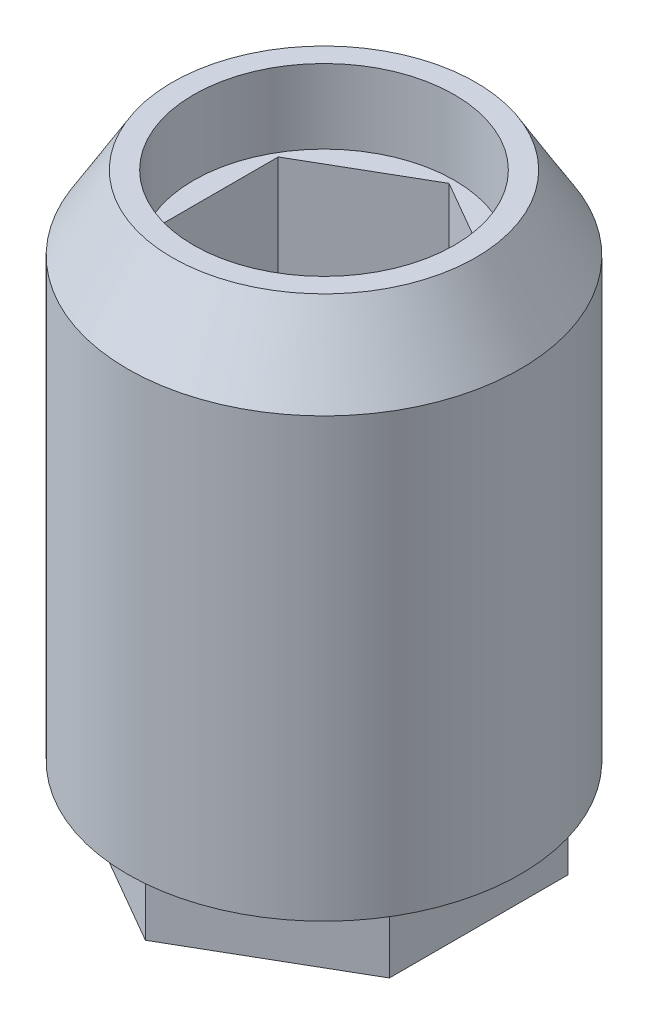
ISO-10303-21;
HEADER;
FILE_DESCRIPTION(('STEP AP214'),'2;1');
FILE_NAME('part.step','',(''),(''),'','','');
FILE_SCHEMA(('AUTOMOTIVE_DESIGN { 1 0 10303 214 1 1 1 1 }'));
ENDSEC;
DATA;
#1=APPLICATION_CONTEXT('core data for automotive mechanical design processes');
#2=APPLICATION_PROTOCOL_DEFINITION('international standard','automotive_design',2000,#1);
#3=PRODUCT_CONTEXT('',#1,'mechanical');
#4=PRODUCT('Part','Part','',(#3));
#5=PRODUCT_RELATED_PRODUCT_CATEGORY('part','',(#4));
#6=PRODUCT_DEFINITION_FORMATION('','',#4);
#7=PRODUCT_DEFINITION_CONTEXT('part definition',#1,'design');
#8=PRODUCT_DEFINITION('design','',#6,#7);
#9=PRODUCT_DEFINITION_SHAPE('','',#8);
#10=(LENGTH_UNIT() NAMED_UNIT(*) SI_UNIT(.MILLI.,.METRE.));
#11=(NAMED_UNIT(*) PLANE_ANGLE_UNIT() SI_UNIT($,.RADIAN.));
#12=(NAMED_UNIT(*) SI_UNIT($,.STERADIAN.) SOLID_ANGLE_UNIT());
#13=UNCERTAINTY_MEASURE_WITH_UNIT(LENGTH_MEASURE(1.E-05),#10,'distance_accuracy_value','');
#14=(GEOMETRIC_REPRESENTATION_CONTEXT(3) GLOBAL_UNCERTAINTY_ASSIGNED_CONTEXT((#13)) GLOBAL_UNIT_ASSIGNED_CONTEXT((#10,
#11,#12)) REPRESENTATION_CONTEXT('',''));
#15=CARTESIAN_POINT('',(0.,0.,0.));
#16=DIRECTION('',(0.,0.,1.));
#17=DIRECTION('',(1.,0.,0.));
#18=AXIS2_PLACEMENT_3D('',#15,#16,#17);
#19=CARTESIAN_POINT('',(0.,0.000100000000002876,7.));
#20=DIRECTION('',(-0.5,0.,0.866025403784439));
#21=DIRECTION('',(0.866025403784439,0.,0.5));
#22=AXIS2_PLACEMENT_3D('',#19,#20,#21);
#23=PLANE('',#22);
#24=DIRECTION('',(-0.866025403784439,0.,-0.5));
#25=VECTOR('',#24,1.);
#26=CARTESIAN_POINT('',(0.,-4.15,7.));
#27=LINE('',#26,#25);
#28=CARTESIAN_POINT('',(0.,-4.15,7.));
#29=VERTEX_POINT('',#28);
#30=CARTESIAN_POINT('',(-6.06217782649107,-4.15,3.5));
#31=VERTEX_POINT('',#30);
#32=EDGE_CURVE('E76',#29,#31,#27,.T.);
#33=ORIENTED_EDGE('',*,*,#32,.F.);
#34=DIRECTION('',(0.,-1.,0.));
#35=VECTOR('',#34,1.);
#36=CARTESIAN_POINT('',(0.,0.000100000000002876,7.));
#37=LINE('',#36,#35);
#38=CARTESIAN_POINT('',(0.,-12.,7.));
#39=VERTEX_POINT('',#38);
#40=EDGE_CURVE('E63',#29,#39,#37,.T.);
#41=ORIENTED_EDGE('',*,*,#40,.T.);
#42=DIRECTION('',(-0.866025403784439,0.,-0.5));
#43=VECTOR('',#42,1.);
#44=CARTESIAN_POINT('',(0.,-12.,7.));
#45=LINE('',#44,#43);
#46=CARTESIAN_POINT('',(-6.06217749556715,-12.,3.49999980890768));
#47=VERTEX_POINT('',#46);
#48=EDGE_CURVE('E357',#39,#47,#45,.T.);
#49=ORIENTED_EDGE('',*,*,#48,.T.);
#50=DIRECTION('',(0.,-1.,0.));
#51=VECTOR('',#50,1.);
#52=CARTESIAN_POINT('',(-6.06217782649107,0.000100000000002876,3.5));
#53=LINE('',#52,#51);
#54=EDGE_CURVE('E204',#31,#47,#53,.T.);
#55=ORIENTED_EDGE('',*,*,#54,.F.);
#56=EDGE_LOOP('',(#33,#41,#49,#55));
#57=FACE_BOUND('',#56,.T.);
#58=ADVANCED_FACE('F58',(#57),#23,.F.);
#59=CARTESIAN_POINT('',(6.06217782649107,0.000100000000002876,3.5));
#60=DIRECTION('',(0.5,0.,0.866025403784439));
#61=DIRECTION('',(0.866025403784439,0.,-0.5));
#62=AXIS2_PLACEMENT_3D('',#59,#60,#61);
#63=PLANE('',#62);
#64=DIRECTION('',(-0.866025403784439,0.,0.5));
#65=VECTOR('',#64,1.);
#66=CARTESIAN_POINT('',(6.06217782649107,-4.15,3.5));
#67=LINE('',#66,#65);
#68=CARTESIAN_POINT('',(6.06217782649107,-4.15,3.5));
#69=VERTEX_POINT('',#68);
#70=EDGE_CURVE('E484',#69,#29,#67,.T.);
#71=ORIENTED_EDGE('',*,*,#70,.F.);
#72=DIRECTION('',(0.,-1.,0.));
#73=VECTOR('',#72,1.);
#74=CARTESIAN_POINT('',(6.06217782649107,0.000100000000002876,3.5));
#75=LINE('',#74,#73);
#76=CARTESIAN_POINT('',(6.06217881883642,-12.,3.50000057292716));
#77=VERTEX_POINT('',#76);
#78=EDGE_CURVE('E239',#69,#77,#75,.T.);
#79=ORIENTED_EDGE('',*,*,#78,.T.);
#80=DIRECTION('',(-0.866025403784439,0.,0.5));
#81=VECTOR('',#80,1.);
#82=CARTESIAN_POINT('',(6.06217782649107,-12.,3.5));
#83=LINE('',#82,#81);
#84=EDGE_CURVE('E391',#77,#39,#83,.T.);
#85=ORIENTED_EDGE('',*,*,#84,.T.);
#86=ORIENTED_EDGE('',*,*,#40,.F.);
#87=EDGE_LOOP('',(#71,#79,#85,#86));
#88=FACE_BOUND('',#87,.T.);
#89=ADVANCED_FACE('F741',(#88),#63,.F.);
#90=CARTESIAN_POINT('',(6.06217782649107,0.000100000000002876,-3.5));
#91=DIRECTION('',(1.,0.,0.));
#92=DIRECTION('',(0.,0.,-1.));
#93=AXIS2_PLACEMENT_3D('',#90,#91,#92);
#94=PLANE('',#93);
#95=DIRECTION('',(0.,0.,1.));
#96=VECTOR('',#95,1.);
#97=CARTESIAN_POINT('',(6.06217782649107,-4.15,-3.5));
#98=LINE('',#97,#96);
#99=CARTESIAN_POINT('',(6.06217782649107,-4.15,-3.5));
#100=VERTEX_POINT('',#99);
#101=EDGE_CURVE('E485',#100,#69,#98,.T.);
#102=ORIENTED_EDGE('',*,*,#101,.F.);
#103=DIRECTION('',(0.,-1.,0.));
#104=VECTOR('',#103,1.);
#105=CARTESIAN_POINT('',(6.06217782649107,0.000100000000002876,-3.5));
#106=LINE('',#105,#104);
#107=CARTESIAN_POINT('',(6.06217749556715,-12.,-3.49999980890768));
#108=VERTEX_POINT('',#107);
#109=EDGE_CURVE('E231',#100,#108,#106,.T.);
#110=ORIENTED_EDGE('',*,*,#109,.T.);
#111=DIRECTION('',(0.,0.,1.));
#112=VECTOR('',#111,1.);
#113=CARTESIAN_POINT('',(6.06217782649107,-12.,-3.5));
#114=LINE('',#113,#112);
#115=EDGE_CURVE('E395',#108,#77,#114,.T.);
#116=ORIENTED_EDGE('',*,*,#115,.T.);
#117=ORIENTED_EDGE('',*,*,#78,.F.);
#118=EDGE_LOOP('',(#102,#110,#116,#117));
#119=FACE_BOUND('',#118,.T.);
#120=ADVANCED_FACE('F746',(#119),#94,.F.);
#121=CARTESIAN_POINT('',(0.,0.000100000000002876,-7.));
#122=DIRECTION('',(0.5,0.,-0.866025403784438));
#123=DIRECTION('',(-0.866025403784438,0.,-0.5));
#124=AXIS2_PLACEMENT_3D('',#121,#122,#123);
#125=PLANE('',#124);
#126=DIRECTION('',(0.866025403784438,0.,0.5));
#127=VECTOR('',#126,1.);
#128=CARTESIAN_POINT('',(0.,-4.15,-7.));
#129=LINE('',#128,#127);
#130=CARTESIAN_POINT('',(0.,-4.15,-7.));
#131=VERTEX_POINT('',#130);
#132=EDGE_CURVE('E193',#131,#100,#129,.T.);
#133=ORIENTED_EDGE('',*,*,#132,.F.);
#134=DIRECTION('',(0.,-1.,0.));
#135=VECTOR('',#134,1.);
#136=CARTESIAN_POINT('',(0.,0.000100000000002876,-7.));
#137=LINE('',#136,#135);
#138=CARTESIAN_POINT('',(0.,-12.,-7.));
#139=VERTEX_POINT('',#138);
#140=EDGE_CURVE('E192',#131,#139,#137,.T.);
#141=ORIENTED_EDGE('',*,*,#140,.T.);
#142=DIRECTION('',(0.866025403784438,0.,0.5));
#143=VECTOR('',#142,1.);
#144=CARTESIAN_POINT('',(0.,-12.,-7.));
#145=LINE('',#144,#143);
#146=EDGE_CURVE('E400',#139,#108,#145,.T.);
#147=ORIENTED_EDGE('',*,*,#146,.T.);
#148=ORIENTED_EDGE('',*,*,#109,.F.);
#149=EDGE_LOOP('',(#133,#141,#147,#148));
#150=FACE_BOUND('',#149,.T.);
#151=ADVANCED_FACE('F780',(#150),#125,.F.);
#152=CARTESIAN_POINT('',(-6.06217782649107,0.000100000000002876,-3.5));
#153=DIRECTION('',(-0.5,0.,-0.866025403784439));
#154=DIRECTION('',(-0.866025403784438,0.,0.5));
#155=AXIS2_PLACEMENT_3D('',#152,#153,#154);
#156=PLANE('',#155);
#157=DIRECTION('',(0.866025403784438,0.,-0.5));
#158=VECTOR('',#157,1.);
#159=CARTESIAN_POINT('',(-6.06217782649107,-4.15,-3.5));
#160=LINE('',#159,#158);
#161=CARTESIAN_POINT('',(-6.06217782649107,-4.15,-3.5));
#162=VERTEX_POINT('',#161);
#163=EDGE_CURVE('E186',#162,#131,#160,.T.);
#164=ORIENTED_EDGE('',*,*,#163,.F.);
#165=DIRECTION('',(0.,-1.,0.));
#166=VECTOR('',#165,1.);
#167=CARTESIAN_POINT('',(-6.06217782649107,0.000100000000002876,-3.5));
#168=LINE('',#167,#166);
#169=CARTESIAN_POINT('',(-6.06217782649107,-12.,-3.5));
#170=VERTEX_POINT('',#169);
#171=EDGE_CURVE('E84',#162,#170,#168,.T.);
#172=ORIENTED_EDGE('',*,*,#171,.T.);
#173=DIRECTION('',(0.866025403784438,0.,-0.5));
#174=VECTOR('',#173,1.);
#175=CARTESIAN_POINT('',(-6.06217782649107,-12.,-3.5));
#176=LINE('',#175,#174);
#177=EDGE_CURVE('E333',#170,#139,#176,.T.);
#178=ORIENTED_EDGE('',*,*,#177,.T.);
#179=ORIENTED_EDGE('',*,*,#140,.F.);
#180=EDGE_LOOP('',(#164,#172,#178,#179));
#181=FACE_BOUND('',#180,.T.);
#182=ADVANCED_FACE('F191',(#181),#156,.F.);
#183=CARTESIAN_POINT('',(-6.06217782649107,0.000100000000002876,3.5));
#184=DIRECTION('',(-1.,0.,0.));
#185=DIRECTION('',(0.,0.,1.));
#186=AXIS2_PLACEMENT_3D('',#183,#184,#185);
#187=PLANE('',#186);
#188=DIRECTION('',(0.,0.,-1.));
#189=VECTOR('',#188,1.);
#190=CARTESIAN_POINT('',(-6.06217782649107,-4.15,3.5));
#191=LINE('',#190,#189);
#192=EDGE_CURVE('E12',#31,#162,#191,.T.);
#193=ORIENTED_EDGE('',*,*,#192,.F.);
#194=ORIENTED_EDGE('',*,*,#54,.T.);
#195=DIRECTION('',(0.,0.,-1.));
#196=VECTOR('',#195,1.);
#197=CARTESIAN_POINT('',(-6.06217782649107,-12.,3.5));
#198=LINE('',#197,#196);
#199=EDGE_CURVE('E199',#47,#170,#198,.T.);
#200=ORIENTED_EDGE('',*,*,#199,.T.);
#201=ORIENTED_EDGE('',*,*,#171,.F.);
#202=EDGE_LOOP('',(#193,#194,#200,#201));
#203=FACE_BOUND('',#202,.T.);
#204=ADVANCED_FACE('F197',(#203),#187,.F.);
#205=DIRECTION('',(-0.866025403784439,0.,-0.5));
#206=VECTOR('',#205,1.);
#207=CARTESIAN_POINT('',(0.,-20.35,7.));
#208=LINE('',#207,#206);
#209=CARTESIAN_POINT('',(0.,-20.35,7.));
#210=VERTEX_POINT('',#209);
#211=CARTESIAN_POINT('',(-6.06217782649107,-20.35,3.5));
#212=VERTEX_POINT('',#211);
#213=EDGE_CURVE('E370',#210,#212,#208,.T.);
#214=ORIENTED_EDGE('',*,*,#213,.F.);
#215=CARTESIAN_POINT('',(0.,-32.35,7.));
#216=VERTEX_POINT('',#215);
#217=EDGE_CURVE('E240',#210,#216,#37,.T.);
#218=ORIENTED_EDGE('',*,*,#217,.T.);
#219=DIRECTION('',(-0.866025403784438,0.,-0.5));
#220=VECTOR('',#219,1.);
#221=CARTESIAN_POINT('',(0.,-32.35,7.));
#222=LINE('',#221,#220);
#223=CARTESIAN_POINT('',(-6.06217782649107,-32.35,3.5));
#224=VERTEX_POINT('',#223);
#225=EDGE_CURVE('E272',#216,#224,#222,.T.);
#226=ORIENTED_EDGE('',*,*,#225,.T.);
#227=EDGE_CURVE('E220',#212,#224,#53,.T.);
#228=ORIENTED_EDGE('',*,*,#227,.F.);
#229=EDGE_LOOP('',(#214,#218,#226,#228));
#230=FACE_BOUND('',#229,.T.);
#231=ADVANCED_FACE('F742',(#230),#23,.F.);
#232=DIRECTION('',(-0.866025403784439,0.,0.5));
#233=VECTOR('',#232,1.);
#234=CARTESIAN_POINT('',(6.06217782649107,-20.35,3.5));
#235=LINE('',#234,#233);
#236=CARTESIAN_POINT('',(6.06217749556714,-20.35,3.49999980890768));
#237=VERTEX_POINT('',#236);
#238=EDGE_CURVE('E256',#237,#210,#235,.T.);
#239=ORIENTED_EDGE('',*,*,#238,.F.);
#240=CARTESIAN_POINT('',(6.06217782649107,-32.35,3.5));
#241=VERTEX_POINT('',#240);
#242=EDGE_CURVE('E232',#237,#241,#75,.T.);
#243=ORIENTED_EDGE('',*,*,#242,.T.);
#244=DIRECTION('',(-0.866025403784439,0.,0.5));
#245=VECTOR('',#244,1.);
#246=CARTESIAN_POINT('',(6.06217782649107,-32.35,3.5));
#247=LINE('',#246,#245);
#248=EDGE_CURVE('E254',#241,#216,#247,.T.);
#249=ORIENTED_EDGE('',*,*,#248,.T.);
#250=ORIENTED_EDGE('',*,*,#217,.F.);
#251=EDGE_LOOP('',(#239,#243,#249,#250));
#252=FACE_BOUND('',#251,.T.);
#253=ADVANCED_FACE('F251',(#252),#63,.F.);
#254=DIRECTION('',(0.,0.,1.));
#255=VECTOR('',#254,1.);
#256=CARTESIAN_POINT('',(6.06217782649107,-20.35,-3.5));
#257=LINE('',#256,#255);
#258=CARTESIAN_POINT('',(6.0621788188364,-20.35,-3.50000057292714));
#259=VERTEX_POINT('',#258);
#260=EDGE_CURVE('E378',#259,#237,#257,.T.);
#261=ORIENTED_EDGE('',*,*,#260,.F.);
#262=CARTESIAN_POINT('',(6.06217782649107,-32.35,-3.5));
#263=VERTEX_POINT('',#262);
#264=EDGE_CURVE('E229',#259,#263,#106,.T.);
#265=ORIENTED_EDGE('',*,*,#264,.T.);
#266=DIRECTION('',(0.,0.,1.));
#267=VECTOR('',#266,1.);
#268=CARTESIAN_POINT('',(6.06217782649107,-32.35,-3.5));
#269=LINE('',#268,#267);
#270=EDGE_CURVE('E260',#263,#241,#269,.T.);
#271=ORIENTED_EDGE('',*,*,#270,.T.);
#272=ORIENTED_EDGE('',*,*,#242,.F.);
#273=EDGE_LOOP('',(#261,#265,#271,#272));
#274=FACE_BOUND('',#273,.T.);
#275=ADVANCED_FACE('F261',(#274),#94,.F.);
#276=DIRECTION('',(0.866025403784438,0.,0.5));
#277=VECTOR('',#276,1.);
#278=CARTESIAN_POINT('',(0.,-20.35,-7.));
#279=LINE('',#278,#277);
#280=CARTESIAN_POINT('',(0.,-20.35,-7.));
#281=VERTEX_POINT('',#280);
#282=EDGE_CURVE('E356',#281,#259,#279,.T.);
#283=ORIENTED_EDGE('',*,*,#282,.F.);
#284=CARTESIAN_POINT('',(0.,-32.35,-7.));
#285=VERTEX_POINT('',#284);
#286=EDGE_CURVE('E200',#281,#285,#137,.T.);
#287=ORIENTED_EDGE('',*,*,#286,.T.);
#288=DIRECTION('',(0.866025403784438,0.,0.5));
#289=VECTOR('',#288,1.);
#290=CARTESIAN_POINT('',(0.,-32.35,-7.));
#291=LINE('',#290,#289);
#292=EDGE_CURVE('E266',#285,#263,#291,.T.);
#293=ORIENTED_EDGE('',*,*,#292,.T.);
#294=ORIENTED_EDGE('',*,*,#264,.F.);
#295=EDGE_LOOP('',(#283,#287,#293,#294));
#296=FACE_BOUND('',#295,.T.);
#297=ADVANCED_FACE('F777',(#296),#125,.F.);
#298=DIRECTION('',(0.866025403784438,0.,-0.5));
#299=VECTOR('',#298,1.);
#300=CARTESIAN_POINT('',(-6.06217782649107,-20.35,-3.5));
#301=LINE('',#300,#299);
#302=CARTESIAN_POINT('',(-6.06217749556713,-20.35,-3.49999980890767));
#303=VERTEX_POINT('',#302);
#304=EDGE_CURVE('E345',#303,#281,#301,.T.);
#305=ORIENTED_EDGE('',*,*,#304,.F.);
#306=CARTESIAN_POINT('',(-6.06217782649107,-32.35,-3.5));
#307=VERTEX_POINT('',#306);
#308=EDGE_CURVE('E201',#303,#307,#168,.T.);
#309=ORIENTED_EDGE('',*,*,#308,.T.);
#310=DIRECTION('',(0.866025403784438,0.,-0.5));
#311=VECTOR('',#310,1.);
#312=CARTESIAN_POINT('',(-6.06217782649107,-32.35,-3.5));
#313=LINE('',#312,#311);
#314=EDGE_CURVE('E365',#307,#285,#313,.T.);
#315=ORIENTED_EDGE('',*,*,#314,.T.);
#316=ORIENTED_EDGE('',*,*,#286,.F.);
#317=EDGE_LOOP('',(#305,#309,#315,#316));
#318=FACE_BOUND('',#317,.T.);
#319=ADVANCED_FACE('F353',(#318),#156,.F.);
#320=DIRECTION('',(0.,0.,-1.));
#321=VECTOR('',#320,1.);
#322=CARTESIAN_POINT('',(-6.06217782649107,-20.35,3.5));
#323=LINE('',#322,#321);
#324=EDGE_CURVE('E69',#212,#303,#323,.T.);
#325=ORIENTED_EDGE('',*,*,#324,.F.);
#326=ORIENTED_EDGE('',*,*,#227,.T.);
#327=DIRECTION('',(0.,0.,-1.));
#328=VECTOR('',#327,1.);
#329=CARTESIAN_POINT('',(-6.06217782649107,-32.35,3.5));
#330=LINE('',#329,#328);
#331=EDGE_CURVE('E363',#224,#307,#330,.T.);
#332=ORIENTED_EDGE('',*,*,#331,.T.);
#333=ORIENTED_EDGE('',*,*,#308,.F.);
#334=EDGE_LOOP('',(#325,#326,#332,#333));
#335=FACE_BOUND('',#334,.T.);
#336=ADVANCED_FACE('F361',(#335),#187,.F.);
#337=CARTESIAN_POINT('',(0.,0.,0.));
#338=DIRECTION('',(0.,1.,0.));
#339=DIRECTION('',(0.,0.,1.));
#340=AXIS2_PLACEMENT_3D('',#337,#338,#339);
#341=PLANE('',#340);
#342=CARTESIAN_POINT('',(0.,0.,0.));
#343=DIRECTION('',(0.,1.,0.));
#344=DIRECTION('',(0.,0.,1.));
#345=AXIS2_PLACEMENT_3D('',#342,#343,#344);
#346=CIRCLE('',#345,7.3);
#347=CARTESIAN_POINT('',(0.,0.,7.3));
#348=VERTEX_POINT('',#347);
#349=EDGE_CURVE('E492',#348,#348,#346,.T.);
#350=ORIENTED_EDGE('',*,*,#349,.F.);
#351=EDGE_LOOP('',(#350));
#352=FACE_BOUND('',#351,.T.);
#353=CARTESIAN_POINT('',(0.,0.,0.));
#354=DIRECTION('',(0.,1.,0.));
#355=DIRECTION('',(0.,0.,1.));
#356=AXIS2_PLACEMENT_3D('',#353,#354,#355);
#357=CIRCLE('',#356,8.5);
#358=CARTESIAN_POINT('',(0.,0.,8.5));
#359=VERTEX_POINT('',#358);
#360=EDGE_CURVE('E223',#359,#359,#357,.T.);
#361=ORIENTED_EDGE('',*,*,#360,.T.);
#362=EDGE_LOOP('',(#361));
#363=FACE_BOUND('',#362,.T.);
#364=ADVANCED_FACE('F498',(#352,#363),#341,.T.);
#365=CARTESIAN_POINT('',(0.,0.,0.));
#366=DIRECTION('',(0.,-1.,0.));
#367=DIRECTION('',(0.,0.,-1.));
#368=AXIS2_PLACEMENT_3D('',#365,#366,#367);
#369=CONICAL_SURFACE('',#368,8.5,0.542189409926878);
#370=ORIENTED_EDGE('',*,*,#360,.F.);
#371=EDGE_LOOP('',(#370));
#372=FACE_BOUND('',#371,.T.);
#373=CARTESIAN_POINT('',(0.,-4.15,0.));
#374=DIRECTION('',(0.,1.,0.));
#375=DIRECTION('',(0.,0.,1.));
#376=AXIS2_PLACEMENT_3D('',#373,#374,#375);
#377=CIRCLE('',#376,11.);
#378=CARTESIAN_POINT('',(0.,-4.15,11.));
#379=VERTEX_POINT('',#378);
#380=EDGE_CURVE('E544',#379,#379,#377,.T.);
#381=ORIENTED_EDGE('',*,*,#380,.T.);
#382=EDGE_LOOP('',(#381));
#383=FACE_BOUND('',#382,.T.);
#384=ADVANCED_FACE('F60',(#372,#383),#369,.T.);
#385=CARTESIAN_POINT('',(0.,-28.65,0.));
#386=DIRECTION('',(0.,1.,0.));
#387=DIRECTION('',(0.,0.,1.));
#388=AXIS2_PLACEMENT_3D('',#385,#386,#387);
#389=PLANE('',#388);
#390=DIRECTION('',(0.,0.,-1.));
#391=VECTOR('',#390,1.);
#392=CARTESIAN_POINT('',(8.66025403784438,-28.65,5.));
#393=LINE('',#392,#391);
#394=CARTESIAN_POINT('',(8.66025403784438,-28.65,5.));
#395=VERTEX_POINT('',#394);
#396=CARTESIAN_POINT('',(8.66025403784438,-28.65,-5.00000000000001));
#397=VERTEX_POINT('',#396);
#398=EDGE_CURVE('E655',#395,#397,#393,.T.);
#399=ORIENTED_EDGE('',*,*,#398,.T.);
#400=DIRECTION('',(-0.866025403784439,0.,-0.5));
#401=VECTOR('',#400,1.);
#402=CARTESIAN_POINT('',(8.66025403784438,-28.65,-5.00000000000001));
#403=LINE('',#402,#401);
#404=CARTESIAN_POINT('',(0.,-28.65,-10.));
#405=VERTEX_POINT('',#404);
#406=EDGE_CURVE('E807',#397,#405,#403,.T.);
#407=ORIENTED_EDGE('',*,*,#406,.T.);
#408=DIRECTION('',(-0.866025403784439,0.,0.5));
#409=VECTOR('',#408,1.);
#410=CARTESIAN_POINT('',(0.,-28.65,-10.));
#411=LINE('',#410,#409);
#412=CARTESIAN_POINT('',(-8.66025403784439,-28.65,-5.));
#413=VERTEX_POINT('',#412);
#414=EDGE_CURVE('E809',#405,#413,#411,.T.);
#415=ORIENTED_EDGE('',*,*,#414,.T.);
#416=DIRECTION('',(0.,0.,1.));
#417=VECTOR('',#416,1.);
#418=CARTESIAN_POINT('',(-8.66025403784439,-28.65,-5.));
#419=LINE('',#418,#417);
#420=CARTESIAN_POINT('',(-8.66025403784439,-28.65,5.));
#421=VERTEX_POINT('',#420);
#422=EDGE_CURVE('E813',#413,#421,#419,.T.);
#423=ORIENTED_EDGE('',*,*,#422,.T.);
#424=DIRECTION('',(0.866025403784438,0.,0.5));
#425=VECTOR('',#424,1.);
#426=CARTESIAN_POINT('',(-8.66025403784439,-28.65,5.));
#427=LINE('',#426,#425);
#428=CARTESIAN_POINT('',(0.,-28.65,10.));
#429=VERTEX_POINT('',#428);
#430=EDGE_CURVE('E823',#421,#429,#427,.T.);
#431=ORIENTED_EDGE('',*,*,#430,.T.);
#432=DIRECTION('',(0.866025403784439,0.,-0.5));
#433=VECTOR('',#432,1.);
#434=CARTESIAN_POINT('',(0.,-28.65,10.));
#435=LINE('',#434,#433);
#436=EDGE_CURVE('E828',#429,#395,#435,.T.);
#437=ORIENTED_EDGE('',*,*,#436,.T.);
#438=EDGE_LOOP('',(#399,#407,#415,#423,#431,#437));
#439=FACE_BOUND('',#438,.T.);
#440=CARTESIAN_POINT('',(0.,-28.65,0.));
#441=DIRECTION('',(0.,1.,0.));
#442=DIRECTION('',(0.,0.,1.));
#443=AXIS2_PLACEMENT_3D('',#440,#441,#442);
#444=CIRCLE('',#443,11.);
#445=CARTESIAN_POINT('',(0.,-28.65,11.));
#446=VERTEX_POINT('',#445);
#447=EDGE_CURVE('E506',#446,#446,#444,.T.);
#448=ORIENTED_EDGE('',*,*,#447,.F.);
#449=EDGE_LOOP('',(#448));
#450=FACE_BOUND('',#449,.T.);
#451=ADVANCED_FACE('F522',(#439,#450),#389,.F.);
#452=CARTESIAN_POINT('',(0.,-4.15,0.));
#453=DIRECTION('',(0.,-1.,0.));
#454=DIRECTION('',(0.,0.,-1.));
#455=AXIS2_PLACEMENT_3D('',#452,#453,#454);
#456=CYLINDRICAL_SURFACE('',#455,11.);
#457=ORIENTED_EDGE('',*,*,#447,.T.);
#458=EDGE_LOOP('',(#457));
#459=FACE_BOUND('',#458,.T.);
#460=ORIENTED_EDGE('',*,*,#380,.F.);
#461=EDGE_LOOP('',(#460));
#462=FACE_BOUND('',#461,.T.);
#463=ADVANCED_FACE('F526',(#459,#462),#456,.T.);
#464=CARTESIAN_POINT('',(0.,-32.35,0.));
#465=DIRECTION('',(0.,1.,0.));
#466=DIRECTION('',(0.,0.,1.));
#467=AXIS2_PLACEMENT_3D('',#464,#465,#466);
#468=PLANE('',#467);
#469=ORIENTED_EDGE('',*,*,#331,.F.);
#470=ORIENTED_EDGE('',*,*,#225,.F.);
#471=ORIENTED_EDGE('',*,*,#248,.F.);
#472=ORIENTED_EDGE('',*,*,#270,.F.);
#473=ORIENTED_EDGE('',*,*,#292,.F.);
#474=ORIENTED_EDGE('',*,*,#314,.F.);
#475=EDGE_LOOP('',(#469,#470,#471,#472,#473,#474));
#476=FACE_BOUND('',#475,.T.);
#477=DIRECTION('',(-0.866025403784439,0.,-0.5));
#478=VECTOR('',#477,1.);
#479=CARTESIAN_POINT('',(8.66025403784438,-32.35,-5.00000000000001));
#480=LINE('',#479,#478);
#481=CARTESIAN_POINT('',(8.66025403784438,-32.35,-5.00000000000001));
#482=VERTEX_POINT('',#481);
#483=CARTESIAN_POINT('',(0.,-32.35,-10.));
#484=VERTEX_POINT('',#483);
#485=EDGE_CURVE('E619',#482,#484,#480,.T.);
#486=ORIENTED_EDGE('',*,*,#485,.F.);
#487=DIRECTION('',(0.,0.,-1.));
#488=VECTOR('',#487,1.);
#489=CARTESIAN_POINT('',(8.66025403784438,-32.35,5.));
#490=LINE('',#489,#488);
#491=CARTESIAN_POINT('',(8.66025403784438,-32.35,5.));
#492=VERTEX_POINT('',#491);
#493=EDGE_CURVE('E549',#492,#482,#490,.T.);
#494=ORIENTED_EDGE('',*,*,#493,.F.);
#495=DIRECTION('',(0.866025403784439,0.,-0.5));
#496=VECTOR('',#495,1.);
#497=CARTESIAN_POINT('',(0.,-32.35,10.));
#498=LINE('',#497,#496);
#499=CARTESIAN_POINT('',(0.,-32.35,10.));
#500=VERTEX_POINT('',#499);
#501=EDGE_CURVE('E553',#500,#492,#498,.T.);
#502=ORIENTED_EDGE('',*,*,#501,.F.);
#503=DIRECTION('',(0.866025403784438,0.,0.5));
#504=VECTOR('',#503,1.);
#505=CARTESIAN_POINT('',(-8.66025403784439,-32.35,5.));
#506=LINE('',#505,#504);
#507=CARTESIAN_POINT('',(-8.66025403784439,-32.35,5.));
#508=VERTEX_POINT('',#507);
#509=EDGE_CURVE('E622',#508,#500,#506,.T.);
#510=ORIENTED_EDGE('',*,*,#509,.F.);
#511=DIRECTION('',(0.,0.,1.));
#512=VECTOR('',#511,1.);
#513=CARTESIAN_POINT('',(-8.66025403784439,-32.35,-5.));
#514=LINE('',#513,#512);
#515=CARTESIAN_POINT('',(-8.66025403784439,-32.35,-5.));
#516=VERTEX_POINT('',#515);
#517=EDGE_CURVE('E618',#516,#508,#514,.T.);
#518=ORIENTED_EDGE('',*,*,#517,.F.);
#519=DIRECTION('',(-0.866025403784439,0.,0.5));
#520=VECTOR('',#519,1.);
#521=CARTESIAN_POINT('',(0.,-32.35,-10.));
#522=LINE('',#521,#520);
#523=EDGE_CURVE('E611',#484,#516,#522,.T.);
#524=ORIENTED_EDGE('',*,*,#523,.F.);
#525=EDGE_LOOP('',(#486,#494,#502,#510,#518,#524));
#526=FACE_BOUND('',#525,.T.);
#527=ADVANCED_FACE('F269',(#476,#526),#468,.F.);
#528=CARTESIAN_POINT('',(4.33012701892218,0.,7.49999999999998));
#529=DIRECTION('',(0.5,0.,0.866025403784439));
#530=DIRECTION('',(0.866025403784439,0.,-0.5));
#531=AXIS2_PLACEMENT_3D('',#528,#529,#530);
#532=PLANE('',#531);
#533=DIRECTION('',(0.,-1.,0.));
#534=VECTOR('',#533,1.);
#535=CARTESIAN_POINT('',(0.,-28.65,10.));
#536=LINE('',#535,#534);
#537=EDGE_CURVE('E650',#429,#500,#536,.T.);
#538=ORIENTED_EDGE('',*,*,#537,.T.);
#539=ORIENTED_EDGE('',*,*,#501,.T.);
#540=DIRECTION('',(0.,-1.,0.));
#541=VECTOR('',#540,1.);
#542=CARTESIAN_POINT('',(8.66025403784438,-28.65,5.));
#543=LINE('',#542,#541);
#544=EDGE_CURVE('E647',#395,#492,#543,.T.);
#545=ORIENTED_EDGE('',*,*,#544,.F.);
#546=ORIENTED_EDGE('',*,*,#436,.F.);
#547=EDGE_LOOP('',(#538,#539,#545,#546));
#548=FACE_BOUND('',#547,.T.);
#549=ADVANCED_FACE('F577',(#548),#532,.T.);
#550=CARTESIAN_POINT('',(8.66025403784437,0.,0.));
#551=DIRECTION('',(1.,0.,0.));
#552=DIRECTION('',(0.,1.,0.));
#553=AXIS2_PLACEMENT_3D('',#550,#551,#552);
#554=PLANE('',#553);
#555=ORIENTED_EDGE('',*,*,#544,.T.);
#556=ORIENTED_EDGE('',*,*,#493,.T.);
#557=DIRECTION('',(0.,-1.,0.));
#558=VECTOR('',#557,1.);
#559=CARTESIAN_POINT('',(8.66025403784438,-28.65,-5.00000000000001));
#560=LINE('',#559,#558);
#561=EDGE_CURVE('E639',#397,#482,#560,.T.);
#562=ORIENTED_EDGE('',*,*,#561,.F.);
#563=ORIENTED_EDGE('',*,*,#398,.F.);
#564=EDGE_LOOP('',(#555,#556,#562,#563));
#565=FACE_BOUND('',#564,.T.);
#566=ADVANCED_FACE('F653',(#565),#554,.T.);
#567=CARTESIAN_POINT('',(-4.33012701892218,0.,7.49999999999998));
#568=DIRECTION('',(-0.5,0.,0.866025403784439));
#569=DIRECTION('',(0.866025403784438,0.,0.5));
#570=AXIS2_PLACEMENT_3D('',#567,#568,#569);
#571=PLANE('',#570);
#572=DIRECTION('',(0.,-1.,0.));
#573=VECTOR('',#572,1.);
#574=CARTESIAN_POINT('',(-8.66025403784439,-28.65,5.));
#575=LINE('',#574,#573);
#576=EDGE_CURVE('E657',#421,#508,#575,.T.);
#577=ORIENTED_EDGE('',*,*,#576,.T.);
#578=ORIENTED_EDGE('',*,*,#509,.T.);
#579=ORIENTED_EDGE('',*,*,#537,.F.);
#580=ORIENTED_EDGE('',*,*,#430,.F.);
#581=EDGE_LOOP('',(#577,#578,#579,#580));
#582=FACE_BOUND('',#581,.T.);
#583=ADVANCED_FACE('F692',(#582),#571,.T.);
#584=CARTESIAN_POINT('',(-8.66025403784437,0.,0.));
#585=DIRECTION('',(-1.,0.,0.));
#586=DIRECTION('',(0.,-1.,0.));
#587=AXIS2_PLACEMENT_3D('',#584,#585,#586);
#588=PLANE('',#587);
#589=DIRECTION('',(0.,-1.,0.));
#590=VECTOR('',#589,1.);
#591=CARTESIAN_POINT('',(-8.66025403784439,-28.65,-5.));
#592=LINE('',#591,#590);
#593=EDGE_CURVE('E659',#413,#516,#592,.T.);
#594=ORIENTED_EDGE('',*,*,#593,.T.);
#595=ORIENTED_EDGE('',*,*,#517,.T.);
#596=ORIENTED_EDGE('',*,*,#576,.F.);
#597=ORIENTED_EDGE('',*,*,#422,.F.);
#598=EDGE_LOOP('',(#594,#595,#596,#597));
#599=FACE_BOUND('',#598,.T.);
#600=ADVANCED_FACE('F698',(#599),#588,.T.);
#601=CARTESIAN_POINT('',(-4.33012701892219,0.,-7.50000000000001));
#602=DIRECTION('',(-0.5,0.,-0.866025403784439));
#603=DIRECTION('',(-0.866025403784439,0.,0.5));
#604=AXIS2_PLACEMENT_3D('',#601,#602,#603);
#605=PLANE('',#604);
#606=DIRECTION('',(0.,-1.,0.));
#607=VECTOR('',#606,1.);
#608=CARTESIAN_POINT('',(0.,-28.65,-10.));
#609=LINE('',#608,#607);
#610=EDGE_CURVE('E666',#405,#484,#609,.T.);
#611=ORIENTED_EDGE('',*,*,#610,.T.);
#612=ORIENTED_EDGE('',*,*,#523,.T.);
#613=ORIENTED_EDGE('',*,*,#593,.F.);
#614=ORIENTED_EDGE('',*,*,#414,.F.);
#615=EDGE_LOOP('',(#611,#612,#613,#614));
#616=FACE_BOUND('',#615,.T.);
#617=ADVANCED_FACE('F727',(#616),#605,.T.);
#618=CARTESIAN_POINT('',(4.33012701892218,0.,-7.49999999999998));
#619=DIRECTION('',(0.5,0.,-0.866025403784439));
#620=DIRECTION('',(-0.866025403784439,0.,-0.5));
#621=AXIS2_PLACEMENT_3D('',#618,#619,#620);
#622=PLANE('',#621);
#623=ORIENTED_EDGE('',*,*,#561,.T.);
#624=ORIENTED_EDGE('',*,*,#485,.T.);
#625=ORIENTED_EDGE('',*,*,#610,.F.);
#626=ORIENTED_EDGE('',*,*,#406,.F.);
#627=EDGE_LOOP('',(#623,#624,#625,#626));
#628=FACE_BOUND('',#627,.T.);
#629=ADVANCED_FACE('F578',(#628),#622,.T.);
#630=CARTESIAN_POINT('',(0.,-20.35,0.));
#631=DIRECTION('',(0.,1.,0.));
#632=DIRECTION('',(0.,0.,1.));
#633=AXIS2_PLACEMENT_3D('',#630,#631,#632);
#634=PLANE('',#633);
#635=ORIENTED_EDGE('',*,*,#213,.T.);
#636=CARTESIAN_POINT('',(0.,-20.35,0.));
#637=DIRECTION('',(0.,1.,0.));
#638=DIRECTION('',(0.,0.,1.));
#639=AXIS2_PLACEMENT_3D('',#636,#637,#638);
#640=CIRCLE('',#639,7.);
#641=EDGE_CURVE('E311',#212,#210,#640,.T.);
#642=ORIENTED_EDGE('',*,*,#641,.T.);
#643=EDGE_LOOP('',(#635,#642));
#644=FACE_BOUND('',#643,.T.);
#645=ADVANCED_FACE('F437',(#644),#634,.T.);
#646=ORIENTED_EDGE('',*,*,#238,.T.);
#647=EDGE_CURVE('E331',#210,#237,#640,.T.);
#648=ORIENTED_EDGE('',*,*,#647,.T.);
#649=EDGE_LOOP('',(#646,#648));
#650=FACE_BOUND('',#649,.T.);
#651=ADVANCED_FACE('F756',(#650),#634,.T.);
#652=ORIENTED_EDGE('',*,*,#260,.T.);
#653=EDGE_CURVE('E329',#237,#259,#640,.T.);
#654=ORIENTED_EDGE('',*,*,#653,.T.);
#655=EDGE_LOOP('',(#652,#654));
#656=FACE_BOUND('',#655,.T.);
#657=ADVANCED_FACE('F761',(#656),#634,.T.);
#658=ORIENTED_EDGE('',*,*,#282,.T.);
#659=EDGE_CURVE('E328',#259,#281,#640,.T.);
#660=ORIENTED_EDGE('',*,*,#659,.T.);
#661=EDGE_LOOP('',(#658,#660));
#662=FACE_BOUND('',#661,.T.);
#663=ADVANCED_FACE('F769',(#662),#634,.T.);
#664=ORIENTED_EDGE('',*,*,#304,.T.);
#665=EDGE_CURVE('E310',#281,#303,#640,.T.);
#666=ORIENTED_EDGE('',*,*,#665,.T.);
#667=EDGE_LOOP('',(#664,#666));
#668=FACE_BOUND('',#667,.T.);
#669=ADVANCED_FACE('F344',(#668),#634,.T.);
#670=ORIENTED_EDGE('',*,*,#324,.T.);
#671=EDGE_CURVE('E307',#303,#212,#640,.T.);
#672=ORIENTED_EDGE('',*,*,#671,.T.);
#673=EDGE_LOOP('',(#670,#672));
#674=FACE_BOUND('',#673,.T.);
#675=ADVANCED_FACE('F757',(#674),#634,.T.);
#676=CARTESIAN_POINT('',(0.,-12.,0.));
#677=DIRECTION('',(0.,1.,0.));
#678=DIRECTION('',(0.,0.,1.));
#679=AXIS2_PLACEMENT_3D('',#676,#677,#678);
#680=PLANE('',#679);
#681=CARTESIAN_POINT('',(0.,-12.,0.));
#682=DIRECTION('',(0.,1.,0.));
#683=DIRECTION('',(0.,0.,1.));
#684=AXIS2_PLACEMENT_3D('',#681,#682,#683);
#685=CIRCLE('',#684,7.);
#686=EDGE_CURVE('E283',#47,#39,#685,.T.);
#687=ORIENTED_EDGE('',*,*,#686,.F.);
#688=ORIENTED_EDGE('',*,*,#48,.F.);
#689=EDGE_LOOP('',(#687,#688));
#690=FACE_BOUND('',#689,.T.);
#691=ADVANCED_FACE('F434',(#690),#680,.F.);
#692=EDGE_CURVE('E300',#39,#77,#685,.T.);
#693=ORIENTED_EDGE('',*,*,#692,.F.);
#694=ORIENTED_EDGE('',*,*,#84,.F.);
#695=EDGE_LOOP('',(#693,#694));
#696=FACE_BOUND('',#695,.T.);
#697=ADVANCED_FACE('F768',(#696),#680,.F.);
#698=EDGE_CURVE('E302',#77,#108,#685,.T.);
#699=ORIENTED_EDGE('',*,*,#698,.F.);
#700=ORIENTED_EDGE('',*,*,#115,.F.);
#701=EDGE_LOOP('',(#699,#700));
#702=FACE_BOUND('',#701,.T.);
#703=ADVANCED_FACE('F796',(#702),#680,.F.);
#704=EDGE_CURVE('E304',#108,#139,#685,.T.);
#705=ORIENTED_EDGE('',*,*,#704,.F.);
#706=ORIENTED_EDGE('',*,*,#146,.F.);
#707=EDGE_LOOP('',(#705,#706));
#708=FACE_BOUND('',#707,.T.);
#709=ADVANCED_FACE('F798',(#708),#680,.F.);
#710=EDGE_CURVE('E282',#139,#170,#685,.T.);
#711=ORIENTED_EDGE('',*,*,#710,.F.);
#712=ORIENTED_EDGE('',*,*,#177,.F.);
#713=EDGE_LOOP('',(#711,#712));
#714=FACE_BOUND('',#713,.T.);
#715=ADVANCED_FACE('F803',(#714),#680,.F.);
#716=EDGE_CURVE('E278',#170,#47,#685,.T.);
#717=ORIENTED_EDGE('',*,*,#716,.F.);
#718=ORIENTED_EDGE('',*,*,#199,.F.);
#719=EDGE_LOOP('',(#717,#718));
#720=FACE_BOUND('',#719,.T.);
#721=ADVANCED_FACE('F433',(#720),#680,.F.);
#722=CARTESIAN_POINT('',(0.,-12.,0.));
#723=DIRECTION('',(0.,-1.,0.));
#724=DIRECTION('',(0.,0.,-1.));
#725=AXIS2_PLACEMENT_3D('',#722,#723,#724);
#726=CYLINDRICAL_SURFACE('',#725,7.);
#727=ORIENTED_EDGE('',*,*,#647,.F.);
#728=ORIENTED_EDGE('',*,*,#641,.F.);
#729=ORIENTED_EDGE('',*,*,#671,.F.);
#730=ORIENTED_EDGE('',*,*,#665,.F.);
#731=ORIENTED_EDGE('',*,*,#659,.F.);
#732=ORIENTED_EDGE('',*,*,#653,.F.);
#733=EDGE_LOOP('',(#727,#728,#729,#730,#731,#732));
#734=FACE_BOUND('',#733,.T.);
#735=ORIENTED_EDGE('',*,*,#692,.T.);
#736=ORIENTED_EDGE('',*,*,#698,.T.);
#737=ORIENTED_EDGE('',*,*,#704,.T.);
#738=ORIENTED_EDGE('',*,*,#710,.T.);
#739=ORIENTED_EDGE('',*,*,#716,.T.);
#740=ORIENTED_EDGE('',*,*,#686,.T.);
#741=EDGE_LOOP('',(#735,#736,#737,#738,#739,#740));
#742=FACE_BOUND('',#741,.T.);
#743=ADVANCED_FACE('F425',(#734,#742),#726,.F.);
#744=CARTESIAN_POINT('',(0.,-4.15,0.));
#745=DIRECTION('',(0.,1.,0.));
#746=DIRECTION('',(0.,0.,1.));
#747=AXIS2_PLACEMENT_3D('',#744,#745,#746);
#748=PLANE('',#747);
#749=CARTESIAN_POINT('',(0.,-4.15,0.));
#750=DIRECTION('',(0.,1.,0.));
#751=DIRECTION('',(0.,0.,1.));
#752=AXIS2_PLACEMENT_3D('',#749,#750,#751);
#753=CIRCLE('',#752,7.3);
#754=CARTESIAN_POINT('',(0.,-4.15,7.3));
#755=VERTEX_POINT('',#754);
#756=EDGE_CURVE('E194',#755,#755,#753,.F.);
#757=ORIENTED_EDGE('',*,*,#756,.F.);
#758=EDGE_LOOP('',(#757));
#759=FACE_BOUND('',#758,.T.);
#760=ORIENTED_EDGE('',*,*,#32,.T.);
#761=ORIENTED_EDGE('',*,*,#192,.T.);
#762=ORIENTED_EDGE('',*,*,#163,.T.);
#763=ORIENTED_EDGE('',*,*,#132,.T.);
#764=ORIENTED_EDGE('',*,*,#101,.T.);
#765=ORIENTED_EDGE('',*,*,#70,.T.);
#766=EDGE_LOOP('',(#760,#761,#762,#763,#764,#765));
#767=FACE_BOUND('',#766,.T.);
#768=ADVANCED_FACE('F185',(#759,#767),#748,.T.);
#769=CARTESIAN_POINT('',(0.,-24.7975180106472,0.));
#770=DIRECTION('',(0.,1.,0.));
#771=DIRECTION('',(0.,0.,1.));
#772=AXIS2_PLACEMENT_3D('',#769,#770,#771);
#773=CYLINDRICAL_SURFACE('',#772,7.3);
#774=ORIENTED_EDGE('',*,*,#756,.T.);
#775=EDGE_LOOP('',(#774));
#776=FACE_BOUND('',#775,.T.);
#777=ORIENTED_EDGE('',*,*,#349,.T.);
#778=EDGE_LOOP('',(#777));
#779=FACE_BOUND('',#778,.T.);
#780=ADVANCED_FACE('F496',(#776,#779),#773,.F.);
#781=CLOSED_SHELL('',(#58,#89,#120,#151,#182,#204,#231,#253,#275,#297,#319,#336,#364,#384,#451,
#463,#527,#549,#566,#583,#600,#617,#629,#645,#651,#657,#663,#669,#675,#691,#697,#703,#709,#715,
#721,#743,#768,#780));
#782=MANIFOLD_SOLID_BREP('B2',#781);
#783=ADVANCED_BREP_SHAPE_REPRESENTATION('',(#18,#782),#14);
#784=SHAPE_DEFINITION_REPRESENTATION(#9,#783);
ENDSEC;
END-ISO-10303-21;
